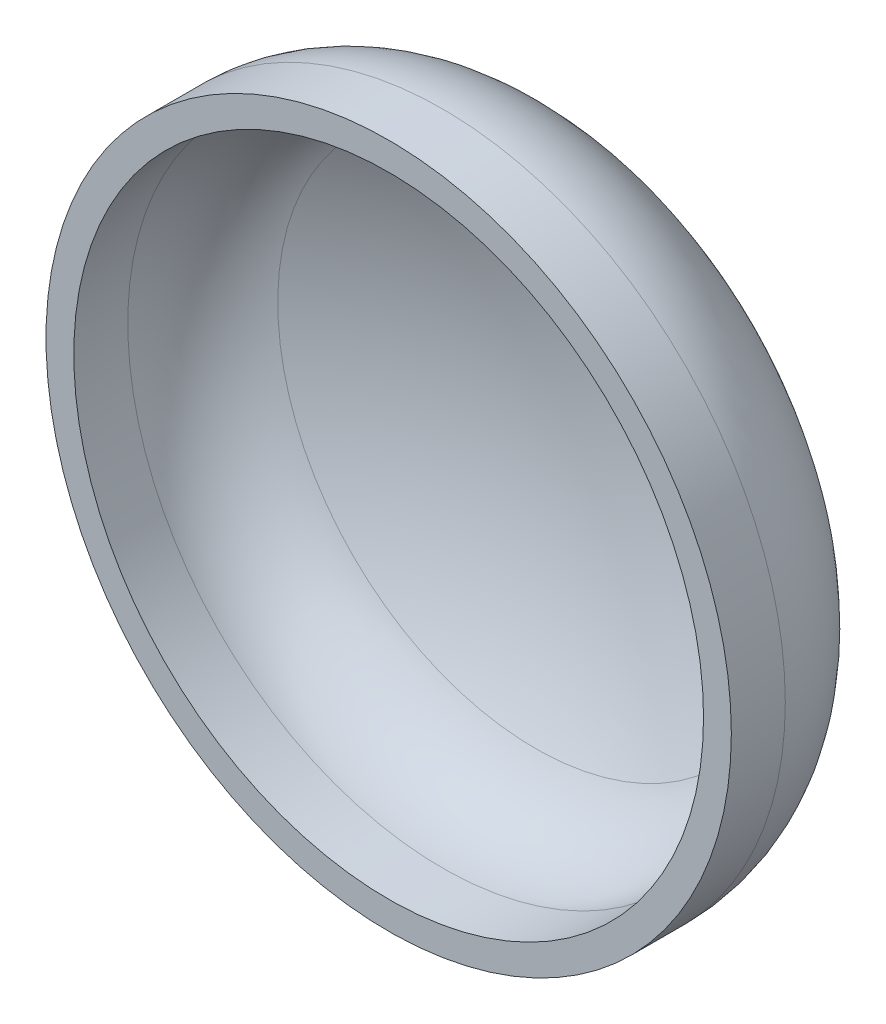
ISO-10303-21;
HEADER;
FILE_DESCRIPTION(('STEP AP214'),'2;1');
FILE_NAME('part.step','',(''),(''),'','','');
FILE_SCHEMA(('AUTOMOTIVE_DESIGN { 1 0 10303 214 1 1 1 1 }'));
ENDSEC;
DATA;
#1=APPLICATION_CONTEXT('core data for automotive mechanical design processes');
#2=APPLICATION_PROTOCOL_DEFINITION('international standard','automotive_design',2000,#1);
#3=PRODUCT_CONTEXT('',#1,'mechanical');
#4=PRODUCT('Part','Part','',(#3));
#5=PRODUCT_RELATED_PRODUCT_CATEGORY('part','',(#4));
#6=PRODUCT_DEFINITION_FORMATION('','',#4);
#7=PRODUCT_DEFINITION_CONTEXT('part definition',#1,'design');
#8=PRODUCT_DEFINITION('design','',#6,#7);
#9=PRODUCT_DEFINITION_SHAPE('','',#8);
#10=(LENGTH_UNIT() NAMED_UNIT(*) SI_UNIT(.MILLI.,.METRE.));
#11=(NAMED_UNIT(*) PLANE_ANGLE_UNIT() SI_UNIT($,.RADIAN.));
#12=(NAMED_UNIT(*) SI_UNIT($,.STERADIAN.) SOLID_ANGLE_UNIT());
#13=UNCERTAINTY_MEASURE_WITH_UNIT(LENGTH_MEASURE(1.E-05),#10,'distance_accuracy_value','');
#14=(GEOMETRIC_REPRESENTATION_CONTEXT(3) GLOBAL_UNCERTAINTY_ASSIGNED_CONTEXT((#13)) GLOBAL_UNIT_ASSIGNED_CONTEXT((#10,
#11,#12)) REPRESENTATION_CONTEXT('',''));
#15=CARTESIAN_POINT('',(0.,0.,0.));
#16=DIRECTION('',(0.,0.,1.));
#17=DIRECTION('',(1.,0.,0.));
#18=AXIS2_PLACEMENT_3D('',#15,#16,#17);
#19=CARTESIAN_POINT('',(0.,254.,0.));
#20=DIRECTION('',(0.,0.,-1.));
#21=DIRECTION('',(-1.,0.,0.));
#22=AXIS2_PLACEMENT_3D('',#19,#20,#21);
#23=PLANE('',#22);
#24=CARTESIAN_POINT('',(0.,0.,0.));
#25=DIRECTION('',(0.,0.,1.));
#26=DIRECTION('',(1.,0.,0.));
#27=AXIS2_PLACEMENT_3D('',#24,#25,#26);
#28=CIRCLE('',#27,233.4);
#29=CARTESIAN_POINT('',(233.4,0.,0.));
#30=VERTEX_POINT('',#29);
#31=EDGE_CURVE('E59',#30,#30,#28,.T.);
#32=ORIENTED_EDGE('',*,*,#31,.F.);
#33=EDGE_LOOP('',(#32));
#34=FACE_BOUND('',#33,.T.);
#35=CARTESIAN_POINT('',(0.,0.,0.));
#36=DIRECTION('',(0.,0.,1.));
#37=DIRECTION('',(1.,0.,0.));
#38=AXIS2_PLACEMENT_3D('',#35,#36,#37);
#39=CIRCLE('',#38,254.);
#40=CARTESIAN_POINT('',(254.,0.,0.));
#41=VERTEX_POINT('',#40);
#42=EDGE_CURVE('E10',#41,#41,#39,.T.);
#43=ORIENTED_EDGE('',*,*,#42,.T.);
#44=EDGE_LOOP('',(#43));
#45=FACE_BOUND('',#44,.T.);
#46=ADVANCED_FACE('F37',(#34,#45),#23,.F.);
#47=CARTESIAN_POINT('',(0.,0.,0.));
#48=DIRECTION('',(0.,0.,1.));
#49=DIRECTION('',(1.,0.,0.));
#50=AXIS2_PLACEMENT_3D('',#47,#48,#49);
#51=CYLINDRICAL_SURFACE('',#50,254.);
#52=ORIENTED_EDGE('',*,*,#42,.F.);
#53=EDGE_LOOP('',(#52));
#54=FACE_BOUND('',#53,.T.);
#55=CARTESIAN_POINT('',(0.,0.,-40.));
#56=DIRECTION('',(0.,0.,1.));
#57=DIRECTION('',(1.,0.,0.));
#58=AXIS2_PLACEMENT_3D('',#55,#56,#57);
#59=CIRCLE('',#58,254.);
#60=CARTESIAN_POINT('',(254.,0.,-40.));
#61=VERTEX_POINT('',#60);
#62=EDGE_CURVE('E43',#61,#61,#59,.T.);
#63=ORIENTED_EDGE('',*,*,#62,.T.);
#64=EDGE_LOOP('',(#63));
#65=FACE_BOUND('',#64,.T.);
#66=ADVANCED_FACE('F66',(#54,#65),#51,.T.);
#67=CARTESIAN_POINT('',(0.,0.,-40.));
#68=DIRECTION('',(0.,0.,1.));
#69=DIRECTION('',(1.,0.,0.));
#70=AXIS2_PLACEMENT_3D('',#67,#68,#69);
#71=TOROIDAL_SURFACE('',#70,156.4,97.6000000000001);
#72=ORIENTED_EDGE('',*,*,#62,.F.);
#73=EDGE_LOOP('',(#72));
#74=FACE_BOUND('',#73,.T.);
#75=CARTESIAN_POINT('',(0.,0.,-127.187829259215));
#76=DIRECTION('',(0.,0.,1.));
#77=DIRECTION('',(1.,0.,0.));
#78=AXIS2_PLACEMENT_3D('',#75,#76,#77);
#79=CIRCLE('',#78,200.263908045977);
#80=CARTESIAN_POINT('',(200.263908045977,0.,-127.187829259215));
#81=VERTEX_POINT('',#80);
#82=EDGE_CURVE('E47',#81,#81,#79,.T.);
#83=ORIENTED_EDGE('',*,*,#82,.T.);
#84=EDGE_LOOP('',(#83));
#85=FACE_BOUND('',#84,.T.);
#86=ADVANCED_FACE('F70',(#74,#85),#71,.T.);
#87=CARTESIAN_POINT('',(0.,0.,270.874637112776));
#88=DIRECTION('',(0.,0.,1.));
#89=DIRECTION('',(0.,1.,0.));
#90=AXIS2_PLACEMENT_3D('',#87,#88,#89);
#91=SPHERICAL_SURFACE('',#90,445.6);
#92=ORIENTED_EDGE('',*,*,#82,.F.);
#93=EDGE_LOOP('',(#92));
#94=FACE_BOUND('',#93,.T.);
#95=ADVANCED_FACE('F75',(#94),#91,.T.);
#96=CARTESIAN_POINT('',(0.,0.,270.874637112776));
#97=DIRECTION('',(0.,0.,1.));
#98=DIRECTION('',(0.,1.,0.));
#99=AXIS2_PLACEMENT_3D('',#96,#97,#98);
#100=SPHERICAL_SURFACE('',#99,425.);
#101=CARTESIAN_POINT('',(0.,0.,-108.785480050815));
#102=DIRECTION('',(0.,0.,1.));
#103=DIRECTION('',(1.,0.,0.));
#104=AXIS2_PLACEMENT_3D('',#101,#102,#103);
#105=CIRCLE('',#104,191.005747126437);
#106=CARTESIAN_POINT('',(191.005747126437,0.,-108.785480050815));
#107=VERTEX_POINT('',#106);
#108=EDGE_CURVE('E51',#107,#107,#105,.T.);
#109=ORIENTED_EDGE('',*,*,#108,.T.);
#110=EDGE_LOOP('',(#109));
#111=FACE_BOUND('',#110,.T.);
#112=ADVANCED_FACE('F81',(#111),#100,.F.);
#113=CARTESIAN_POINT('',(0.,0.,-40.));
#114=DIRECTION('',(0.,0.,1.));
#115=DIRECTION('',(1.,0.,0.));
#116=AXIS2_PLACEMENT_3D('',#113,#114,#115);
#117=TOROIDAL_SURFACE('',#116,156.4,77.);
#118=ORIENTED_EDGE('',*,*,#108,.F.);
#119=EDGE_LOOP('',(#118));
#120=FACE_BOUND('',#119,.T.);
#121=CARTESIAN_POINT('',(0.,0.,-40.));
#122=DIRECTION('',(0.,0.,1.));
#123=DIRECTION('',(1.,0.,0.));
#124=AXIS2_PLACEMENT_3D('',#121,#122,#123);
#125=CIRCLE('',#124,233.4);
#126=CARTESIAN_POINT('',(233.4,0.,-40.));
#127=VERTEX_POINT('',#126);
#128=EDGE_CURVE('E56',#127,#127,#125,.T.);
#129=ORIENTED_EDGE('',*,*,#128,.T.);
#130=EDGE_LOOP('',(#129));
#131=FACE_BOUND('',#130,.T.);
#132=ADVANCED_FACE('F85',(#120,#131),#117,.F.);
#133=CARTESIAN_POINT('',(0.,0.,0.));
#134=DIRECTION('',(0.,0.,1.));
#135=DIRECTION('',(1.,0.,0.));
#136=AXIS2_PLACEMENT_3D('',#133,#134,#135);
#137=CYLINDRICAL_SURFACE('',#136,233.4);
#138=ORIENTED_EDGE('',*,*,#128,.F.);
#139=EDGE_LOOP('',(#138));
#140=FACE_BOUND('',#139,.T.);
#141=ORIENTED_EDGE('',*,*,#31,.T.);
#142=EDGE_LOOP('',(#141));
#143=FACE_BOUND('',#142,.T.);
#144=ADVANCED_FACE('F63',(#140,#143),#137,.F.);
#145=CLOSED_SHELL('',(#46,#66,#86,#95,#112,#132,#144));
#146=MANIFOLD_SOLID_BREP('B2',#145);
#147=ADVANCED_BREP_SHAPE_REPRESENTATION('',(#18,#146),#14);
#148=SHAPE_DEFINITION_REPRESENTATION(#9,#147);
ENDSEC;
END-ISO-10303-21;
